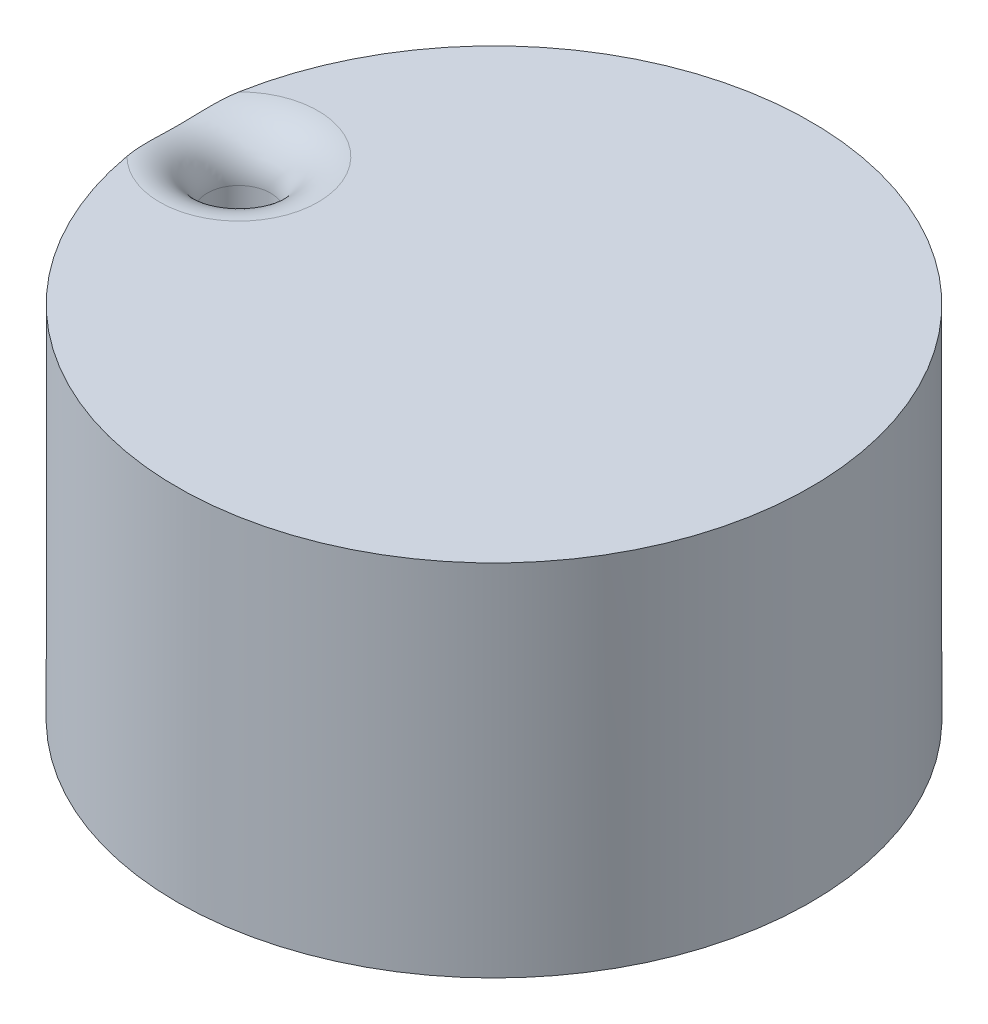
ISO-10303-21;
HEADER;
FILE_DESCRIPTION(('STEP AP214'),'2;1');
FILE_NAME('part.step','',(''),(''),'','','');
FILE_SCHEMA(('AUTOMOTIVE_DESIGN { 1 0 10303 214 1 1 1 1 }'));
ENDSEC;
DATA;
#1=APPLICATION_CONTEXT('core data for automotive mechanical design processes');
#2=APPLICATION_PROTOCOL_DEFINITION('international standard','automotive_design',2000,#1);
#3=PRODUCT_CONTEXT('',#1,'mechanical');
#4=PRODUCT('Part','Part','',(#3));
#5=PRODUCT_RELATED_PRODUCT_CATEGORY('part','',(#4));
#6=PRODUCT_DEFINITION_FORMATION('','',#4);
#7=PRODUCT_DEFINITION_CONTEXT('part definition',#1,'design');
#8=PRODUCT_DEFINITION('design','',#6,#7);
#9=PRODUCT_DEFINITION_SHAPE('','',#8);
#10=(LENGTH_UNIT() NAMED_UNIT(*) SI_UNIT(.MILLI.,.METRE.));
#11=(NAMED_UNIT(*) PLANE_ANGLE_UNIT() SI_UNIT($,.RADIAN.));
#12=(NAMED_UNIT(*) SI_UNIT($,.STERADIAN.) SOLID_ANGLE_UNIT());
#13=UNCERTAINTY_MEASURE_WITH_UNIT(LENGTH_MEASURE(1.E-05),#10,'distance_accuracy_value','');
#14=(GEOMETRIC_REPRESENTATION_CONTEXT(3) GLOBAL_UNCERTAINTY_ASSIGNED_CONTEXT((#13)) GLOBAL_UNIT_ASSIGNED_CONTEXT((#10,
#11,#12)) REPRESENTATION_CONTEXT('',''));
#15=CARTESIAN_POINT('',(0.,0.,0.));
#16=DIRECTION('',(0.,0.,1.));
#17=DIRECTION('',(1.,0.,0.));
#18=AXIS2_PLACEMENT_3D('',#15,#16,#17);
#19=CARTESIAN_POINT('',(0.,57.658,0.));
#20=DIRECTION('',(0.,-1.,0.));
#21=DIRECTION('',(0.,0.,-1.));
#22=AXIS2_PLACEMENT_3D('',#19,#20,#21);
#23=CYLINDRICAL_SURFACE('',#22,50.8);
#24=CARTESIAN_POINT('',(0.,57.658,0.));
#25=DIRECTION('',(0.,1.,0.));
#26=DIRECTION('',(0.,0.,1.));
#27=AXIS2_PLACEMENT_3D('',#24,#25,#26);
#28=CIRCLE('',#27,50.8);
#29=CARTESIAN_POINT('',(-50.0209282958595,57.658,8.86265944400924));
#30=VERTEX_POINT('',#29);
#31=CARTESIAN_POINT('',(-49.9821723070956,57.658,-9.07868115222702));
#32=VERTEX_POINT('',#31);
#33=EDGE_CURVE('E56',#30,#32,#28,.T.);
#34=ORIENTED_EDGE('',*,*,#33,.F.);
#35=CARTESIAN_POINT('',(-50.0209282958595,57.658,8.86265944400924));
#36=CARTESIAN_POINT('',(-50.0680090138,57.6580165219182,8.59694638844474));
#37=CARTESIAN_POINT('',(-50.1129598430025,57.6533400743512,8.33090861536181));
#38=CARTESIAN_POINT('',(-50.1985667736892,57.6361895984098,7.79849397382037));
#39=CARTESIAN_POINT('',(-50.2392245647797,57.6237186511799,7.53211728083918));
#40=CARTESIAN_POINT('',(-50.3161978802419,57.5925851907436,6.99946959008524));
#41=CARTESIAN_POINT('',(-50.3525189533221,57.5739307072122,6.7331989012836));
#42=CARTESIAN_POINT('',(-50.4208944043632,57.5321244744688,6.20044560592699));
#43=CARTESIAN_POINT('',(-50.4529483374275,57.508972256936,5.93396298018446));
#44=CARTESIAN_POINT('',(-50.5428307010349,57.4353542160749,5.13333803564688));
#45=CARTESIAN_POINT('',(-50.5942598616617,57.3807864426068,4.59884845788098));
#46=CARTESIAN_POINT('',(-50.6587057531426,57.3020481131609,3.79573988273506));
#47=CARTESIAN_POINT('',(-50.6780736924965,57.2763166498477,3.5277608444767));
#48=CARTESIAN_POINT('',(-50.7125680898825,57.2277724542633,2.99126967828886));
#49=CARTESIAN_POINT('',(-50.7276947864006,57.2049595579198,2.72275758118879));
#50=CARTESIAN_POINT('',(-50.7535388129993,57.1642178234021,2.18837646737326));
#51=CARTESIAN_POINT('',(-50.7643066467919,57.1462339085777,1.92251418387027));
#52=CARTESIAN_POINT('',(-50.7816689954862,57.1161845719621,1.39031404259364));
#53=CARTESIAN_POINT('',(-50.7882635747327,57.1041190589196,1.12397619221595));
#54=CARTESIAN_POINT('',(-50.7972596039703,57.0868782096738,0.591098302157291));
#55=CARTESIAN_POINT('',(-50.7996625865197,57.0817003553257,0.324558372037241));
#56=CARTESIAN_POINT('',(-50.8002712045402,57.0786525130412,-0.208568492038167));
#57=CARTESIAN_POINT('',(-50.7984768523363,57.0807825036463,-0.475155425853206));
#58=CARTESIAN_POINT('',(-50.7907021542902,57.0921643503528,-1.00764899986478));
#59=CARTESIAN_POINT('',(-50.7847290762509,57.1014038441117,-1.27355601790145));
#60=CARTESIAN_POINT('',(-50.7686206586498,57.1262417447999,-1.80494323029662));
#61=CARTESIAN_POINT('',(-50.7584852467377,57.1418402622625,-2.07042341715536));
#62=CARTESIAN_POINT('',(-50.7340694958071,57.1781800830351,-2.60090742532277));
#63=CARTESIAN_POINT('',(-50.7197879786624,57.1989228478515,-2.86591108966064));
#64=CARTESIAN_POINT('',(-50.6870978428632,57.2439945893908,-3.39535938688738));
#65=CARTESIAN_POINT('',(-50.6686890901224,57.2683236826181,-3.65980400133194));
#66=CARTESIAN_POINT('',(-50.6315697008395,57.3141099788875,-4.13891464127494));
#67=CARTESIAN_POINT('',(-50.6135558514939,57.3352564061377,-4.35366511323449));
#68=CARTESIAN_POINT('',(-50.5748030324278,57.3777835775212,-4.78285645575434));
#69=CARTESIAN_POINT('',(-50.554064521359,57.3991642816638,-4.99729737229465));
#70=CARTESIAN_POINT('',(-50.4877459748147,57.4621827205182,-5.64032379270124));
#71=CARTESIAN_POINT('',(-50.4380624622716,57.5026974089918,-6.06861895339206));
#72=CARTESIAN_POINT('',(-50.3550955018477,57.5556484482796,-6.71204216662235));
#73=CARTESIAN_POINT('',(-50.3259248331944,57.5720354411768,-6.92737733213942));
#74=CARTESIAN_POINT('',(-50.2647871558439,57.6012251361866,-7.35788295733044));
#75=CARTESIAN_POINT('',(-50.2328203540553,57.6140281032165,-7.57305342800492));
#76=CARTESIAN_POINT('',(-50.1660423192135,57.6351894555602,-8.00347936877998));
#77=CARTESIAN_POINT('',(-50.1312272853125,57.6435417862934,-8.21873455803195));
#78=CARTESIAN_POINT('',(-50.0587959929333,57.6549511591382,-8.64896343311409));
#79=CARTESIAN_POINT('',(-50.0211790649408,57.658006931373,-8.86393703909171));
#80=CARTESIAN_POINT('',(-49.9821723070956,57.658,-9.07868115222702));
#81=B_SPLINE_CURVE_WITH_KNOTS('',3,(#35,#36,#37,#38,#39,#40,#41,#42,#43,#44,#45,#46,#47,#48,#49,
#50,#51,#52,#53,#54,#55,#56,#57,#58,#59,#60,#61,#62,#63,#64,#65,#66,#67,#68,#69,#70,#71,#72,#73,
#74,#75,#76,#77,#78,#79,#80),.UNSPECIFIED.,.F.,.F.,(4,2,2,2,2,2,2,2,2,2,2,2,2,2,2,2,2,2,2,2,2,2,
4),(0.,0.809431355932161,1.61854294802187,2.42660795182677,3.23475713949552,4.85357530851356,
5.66326860992393,6.47291637297212,7.27289446303615,8.07286021846093,8.87253342398576,
9.67220428137419,10.4704877665611,11.2687851282108,12.0673095504585,12.8658599190539,
13.5154596991319,14.1649502695748,15.4639133046866,16.1176330105416,16.7713043832074,
17.4258627452047,18.0805780192086),.UNSPECIFIED.);
#82=EDGE_CURVE('E11',#30,#32,#81,.T.);
#83=ORIENTED_EDGE('',*,*,#82,.T.);
#84=EDGE_LOOP('',(#34,#83));
#85=FACE_BOUND('',#84,.T.);
#86=CARTESIAN_POINT('',(0.,0.,0.));
#87=DIRECTION('',(0.,1.,0.));
#88=DIRECTION('',(0.,0.,1.));
#89=AXIS2_PLACEMENT_3D('',#86,#87,#88);
#90=CIRCLE('',#89,50.8);
#91=CARTESIAN_POINT('',(0.,0.,50.8));
#92=VERTEX_POINT('',#91);
#93=EDGE_CURVE('E60',#92,#92,#90,.T.);
#94=ORIENTED_EDGE('',*,*,#93,.T.);
#95=EDGE_LOOP('',(#94));
#96=FACE_BOUND('',#95,.T.);
#97=ADVANCED_FACE('F33',(#85,#96),#23,.T.);
#98=CARTESIAN_POINT('',(0.,57.658,0.));
#99=DIRECTION('',(0.,1.,0.));
#100=DIRECTION('',(0.,0.,1.));
#101=AXIS2_PLACEMENT_3D('',#98,#99,#100);
#102=PLANE('',#101);
#103=ORIENTED_EDGE('',*,*,#33,.T.);
#104=CARTESIAN_POINT('',(-41.0117604381517,57.658,-0.0885915585961961));
#105=DIRECTION('',(0.,1.,0.));
#106=DIRECTION('',(0.,0.,1.));
#107=AXIS2_PLACEMENT_3D('',#104,#105,#106);
#108=CIRCLE('',#107,12.7);
#109=EDGE_CURVE('E46',#32,#30,#108,.F.);
#110=ORIENTED_EDGE('',*,*,#109,.T.);
#111=EDGE_LOOP('',(#103,#110));
#112=FACE_BOUND('',#111,.T.);
#113=ADVANCED_FACE('F58',(#112),#102,.T.);
#114=CARTESIAN_POINT('',(0.,0.,0.));
#115=DIRECTION('',(0.,1.,0.));
#116=DIRECTION('',(0.,0.,1.));
#117=AXIS2_PLACEMENT_3D('',#114,#115,#116);
#118=PLANE('',#117);
#119=CARTESIAN_POINT('',(-41.0117604381517,0.,-0.0885915585961961));
#120=DIRECTION('',(0.,1.,0.));
#121=DIRECTION('',(0.,0.,1.));
#122=AXIS2_PLACEMENT_3D('',#119,#120,#121);
#123=CIRCLE('',#122,5.08);
#124=CARTESIAN_POINT('',(-41.0117604381517,0.,4.99140844140381));
#125=VERTEX_POINT('',#124);
#126=EDGE_CURVE('E67',#125,#125,#123,.T.);
#127=ORIENTED_EDGE('',*,*,#126,.T.);
#128=EDGE_LOOP('',(#127));
#129=FACE_BOUND('',#128,.T.);
#130=ORIENTED_EDGE('',*,*,#93,.F.);
#131=EDGE_LOOP('',(#130));
#132=FACE_BOUND('',#131,.T.);
#133=ADVANCED_FACE('F72',(#129,#132),#118,.F.);
#134=CARTESIAN_POINT('',(-41.0117604381517,0.,-0.0885915585961961));
#135=DIRECTION('',(0.,1.,0.));
#136=DIRECTION('',(0.,0.,1.));
#137=AXIS2_PLACEMENT_3D('',#134,#135,#136);
#138=CYLINDRICAL_SURFACE('',#137,5.08);
#139=CARTESIAN_POINT('',(-41.0117604381517,50.038,-0.0885915585961961));
#140=DIRECTION('',(0.,1.,0.));
#141=DIRECTION('',(0.,0.,1.));
#142=AXIS2_PLACEMENT_3D('',#139,#140,#141);
#143=CIRCLE('',#142,5.08);
#144=CARTESIAN_POINT('',(-41.0117604381517,50.038,4.99140844140381));
#145=VERTEX_POINT('',#144);
#146=EDGE_CURVE('E59',#145,#145,#143,.T.);
#147=CARTESIAN_POINT('',(-41.0117604381517,50.038,4.99140844140381));
#148=CARTESIAN_POINT('',(-41.0117604381517,49.5167708333333,4.99140844140381));
#149=CARTESIAN_POINT('',(-41.0117604381517,48.9955416666667,4.99140844140381));
#150=CARTESIAN_POINT('',(-41.0117604381517,47.9530833333333,4.99140844140381));
#151=CARTESIAN_POINT('',(-41.0117604381517,47.4318541666667,4.99140844140381));
#152=CARTESIAN_POINT('',(-41.0117604381517,46.3893958333333,4.99140844140381));
#153=CARTESIAN_POINT('',(-41.0117604381517,45.8681666666667,4.99140844140381));
#154=CARTESIAN_POINT('',(-41.0117604381517,44.8257083333333,4.99140844140381));
#155=CARTESIAN_POINT('',(-41.0117604381517,44.3044791666667,4.99140844140381));
#156=CARTESIAN_POINT('',(-41.0117604381517,43.2620208333333,4.99140844140381));
#157=CARTESIAN_POINT('',(-41.0117604381517,42.7407916666667,4.99140844140381));
#158=CARTESIAN_POINT('',(-41.0117604381517,41.6983333333333,4.99140844140381));
#159=CARTESIAN_POINT('',(-41.0117604381517,41.1771041666667,4.99140844140381));
#160=CARTESIAN_POINT('',(-41.0117604381517,40.1346458333333,4.99140844140381));
#161=CARTESIAN_POINT('',(-41.0117604381517,39.6134166666667,4.99140844140381));
#162=CARTESIAN_POINT('',(-41.0117604381517,38.5709583333333,4.99140844140381));
#163=CARTESIAN_POINT('',(-41.0117604381517,38.0497291666667,4.99140844140381));
#164=CARTESIAN_POINT('',(-41.0117604381517,37.0072708333333,4.99140844140381));
#165=CARTESIAN_POINT('',(-41.0117604381517,36.4860416666667,4.99140844140381));
#166=CARTESIAN_POINT('',(-41.0117604381517,35.4435833333333,4.99140844140381));
#167=CARTESIAN_POINT('',(-41.0117604381517,34.9223541666667,4.99140844140381));
#168=CARTESIAN_POINT('',(-41.0117604381517,33.8798958333333,4.99140844140381));
#169=CARTESIAN_POINT('',(-41.0117604381517,33.3586666666667,4.99140844140381));
#170=CARTESIAN_POINT('',(-41.0117604381517,32.3162083333333,4.99140844140381));
#171=CARTESIAN_POINT('',(-41.0117604381517,31.7949791666667,4.99140844140381));
#172=CARTESIAN_POINT('',(-41.0117604381517,30.7525208333333,4.99140844140381));
#173=CARTESIAN_POINT('',(-41.0117604381517,30.2312916666667,4.99140844140381));
#174=CARTESIAN_POINT('',(-41.0117604381517,29.1888333333333,4.99140844140381));
#175=CARTESIAN_POINT('',(-41.0117604381517,28.6676041666667,4.99140844140381));
#176=CARTESIAN_POINT('',(-41.0117604381517,27.6251458333333,4.99140844140381));
#177=CARTESIAN_POINT('',(-41.0117604381517,27.1039166666667,4.99140844140381));
#178=CARTESIAN_POINT('',(-41.0117604381517,26.0614583333333,4.99140844140381));
#179=CARTESIAN_POINT('',(-41.0117604381517,25.5402291666667,4.99140844140381));
#180=CARTESIAN_POINT('',(-41.0117604381517,24.4977708333333,4.99140844140381));
#181=CARTESIAN_POINT('',(-41.0117604381517,23.9765416666667,4.99140844140381));
#182=CARTESIAN_POINT('',(-41.0117604381517,22.9340833333333,4.99140844140381));
#183=CARTESIAN_POINT('',(-41.0117604381517,22.4128541666667,4.99140844140381));
#184=CARTESIAN_POINT('',(-41.0117604381517,21.3703958333333,4.99140844140381));
#185=CARTESIAN_POINT('',(-41.0117604381517,20.8491666666667,4.99140844140381));
#186=CARTESIAN_POINT('',(-41.0117604381517,19.8067083333333,4.99140844140381));
#187=CARTESIAN_POINT('',(-41.0117604381517,19.2854791666667,4.99140844140381));
#188=CARTESIAN_POINT('',(-41.0117604381517,18.2430208333333,4.99140844140381));
#189=CARTESIAN_POINT('',(-41.0117604381517,17.7217916666667,4.99140844140381));
#190=CARTESIAN_POINT('',(-41.0117604381517,16.6793333333333,4.99140844140381));
#191=CARTESIAN_POINT('',(-41.0117604381517,16.1581041666667,4.99140844140381));
#192=CARTESIAN_POINT('',(-41.0117604381517,15.1156458333333,4.99140844140381));
#193=CARTESIAN_POINT('',(-41.0117604381517,14.5944166666667,4.99140844140381));
#194=CARTESIAN_POINT('',(-41.0117604381517,13.5519583333333,4.99140844140381));
#195=CARTESIAN_POINT('',(-41.0117604381517,13.0307291666667,4.99140844140381));
#196=CARTESIAN_POINT('',(-41.0117604381517,11.9882708333333,4.99140844140381));
#197=CARTESIAN_POINT('',(-41.0117604381517,11.4670416666667,4.99140844140381));
#198=CARTESIAN_POINT('',(-41.0117604381517,10.4245833333333,4.99140844140381));
#199=CARTESIAN_POINT('',(-41.0117604381517,9.90335416666666,4.99140844140381));
#200=CARTESIAN_POINT('',(-41.0117604381517,8.86089583333333,4.99140844140381));
#201=CARTESIAN_POINT('',(-41.0117604381517,8.33966666666666,4.99140844140381));
#202=CARTESIAN_POINT('',(-41.0117604381517,7.29720833333333,4.99140844140381));
#203=CARTESIAN_POINT('',(-41.0117604381517,6.77597916666667,4.99140844140381));
#204=CARTESIAN_POINT('',(-41.0117604381517,5.73352083333334,4.99140844140381));
#205=CARTESIAN_POINT('',(-41.0117604381517,5.21229166666667,4.99140844140381));
#206=CARTESIAN_POINT('',(-41.0117604381517,4.16983333333334,4.99140844140381));
#207=CARTESIAN_POINT('',(-41.0117604381517,3.64860416666667,4.99140844140381));
#208=CARTESIAN_POINT('',(-41.0117604381517,2.60614583333333,4.99140844140381));
#209=CARTESIAN_POINT('',(-41.0117604381517,2.08491666666667,4.99140844140381));
#210=CARTESIAN_POINT('',(-41.0117604381517,1.04245833333333,4.99140844140381));
#211=CARTESIAN_POINT('',(-41.0117604381517,0.521229166666666,4.99140844140381));
#212=CARTESIAN_POINT('',(-41.0117604381517,0.,4.99140844140381));
#213=B_SPLINE_CURVE_WITH_KNOTS('',3,(#147,#148,#149,#150,#151,#152,#153,#154,#155,#156,#157,
#158,#159,#160,#161,#162,#163,#164,#165,#166,#167,#168,#169,#170,#171,#172,#173,#174,#175,#176,
#177,#178,#179,#180,#181,#182,#183,#184,#185,#186,#187,#188,#189,#190,#191,#192,#193,#194,#195,
#196,#197,#198,#199,#200,#201,#202,#203,#204,#205,#206,#207,#208,#209,#210,#211,#212),
.UNSPECIFIED.,.F.,.F.,(4,2,2,2,2,2,2,2,2,2,2,2,2,2,2,2,2,2,2,2,2,2,2,2,2,2,2,2,2,2,2,2,4),(0.,
1.5636875,3.127375,4.6910625,6.25475,7.8184375,9.382125,10.9458125,12.5095,14.0731875,15.636875,
17.2005625,18.76425,20.3279375,21.891625,23.4553125,25.019,26.5826875,28.146375,29.7100625,
31.27375,32.8374375,34.401125,35.9648125,37.5285,39.0921875,40.655875,42.2195625,43.78325,
45.3469375,46.910625,48.4743125,50.038),.UNSPECIFIED.);
#214=EDGE_CURVE('BSEAM75',#145,#125,#213,.T.);
#215=ORIENTED_EDGE('',*,*,#146,.T.);
#216=ORIENTED_EDGE('',*,*,#126,.F.);
#217=ORIENTED_EDGE('',*,*,#214,.T.);
#218=ORIENTED_EDGE('',*,*,#214,.F.);
#219=EDGE_LOOP('',(#215,#217,#216,#218));
#220=FACE_BOUND('',#219,.T.);
#221=ADVANCED_FACE('F75',(#220),#138,.F.);
#222=CARTESIAN_POINT('',(-41.0117604381517,50.038,-0.0885915585961961));
#223=DIRECTION('',(0.,1.,0.));
#224=DIRECTION('',(0.,0.,1.));
#225=AXIS2_PLACEMENT_3D('',#222,#223,#224);
#226=TOROIDAL_SURFACE('',#225,12.7,7.62);
#227=ORIENTED_EDGE('',*,*,#82,.F.);
#228=ORIENTED_EDGE('',*,*,#109,.F.);
#229=EDGE_LOOP('',(#227,#228));
#230=FACE_BOUND('',#229,.T.);
#231=ORIENTED_EDGE('',*,*,#146,.F.);
#232=EDGE_LOOP('',(#231));
#233=FACE_BOUND('',#232,.T.);
#234=ADVANCED_FACE('F35',(#230,#233),#226,.T.);
#235=CLOSED_SHELL('',(#97,#113,#133,#221,#234));
#236=MANIFOLD_SOLID_BREP('B2',#235);
#237=ADVANCED_BREP_SHAPE_REPRESENTATION('',(#18,#236),#14);
#238=SHAPE_DEFINITION_REPRESENTATION(#9,#237);
ENDSEC;
END-ISO-10303-21;
